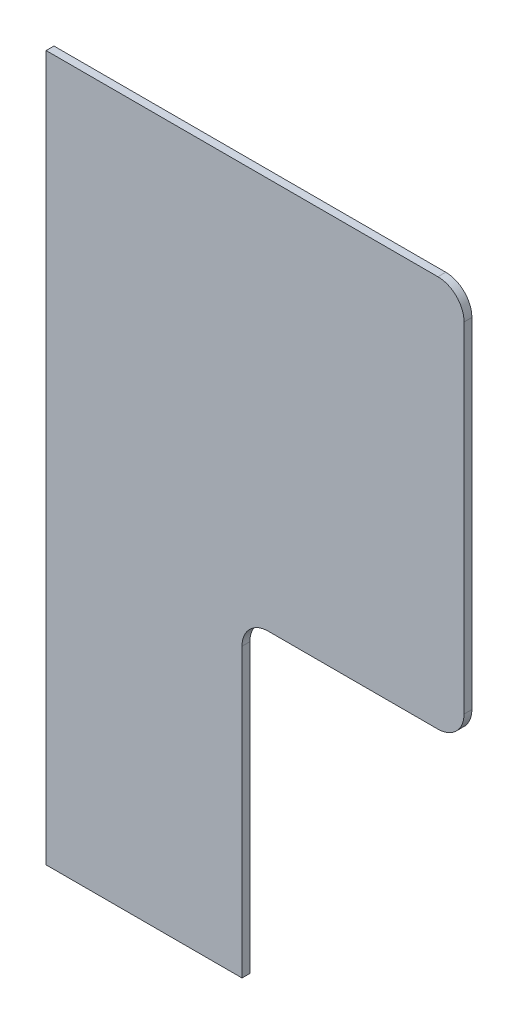
ISO-10303-21;
HEADER;
FILE_DESCRIPTION(('STEP AP214'),'2;1');
FILE_NAME('part.step','',(''),(''),'','','');
FILE_SCHEMA(('AUTOMOTIVE_DESIGN { 1 0 10303 214 1 1 1 1 }'));
ENDSEC;
DATA;
#1=APPLICATION_CONTEXT('core data for automotive mechanical design processes');
#2=APPLICATION_PROTOCOL_DEFINITION('international standard','automotive_design',2000,#1);
#3=PRODUCT_CONTEXT('',#1,'mechanical');
#4=PRODUCT('Part','Part','',(#3));
#5=PRODUCT_RELATED_PRODUCT_CATEGORY('part','',(#4));
#6=PRODUCT_DEFINITION_FORMATION('','',#4);
#7=PRODUCT_DEFINITION_CONTEXT('part definition',#1,'design');
#8=PRODUCT_DEFINITION('design','',#6,#7);
#9=PRODUCT_DEFINITION_SHAPE('','',#8);
#10=(LENGTH_UNIT() NAMED_UNIT(*) SI_UNIT(.MILLI.,.METRE.));
#11=(NAMED_UNIT(*) PLANE_ANGLE_UNIT() SI_UNIT($,.RADIAN.));
#12=(NAMED_UNIT(*) SI_UNIT($,.STERADIAN.) SOLID_ANGLE_UNIT());
#13=UNCERTAINTY_MEASURE_WITH_UNIT(LENGTH_MEASURE(1.E-05),#10,'distance_accuracy_value','');
#14=(GEOMETRIC_REPRESENTATION_CONTEXT(3) GLOBAL_UNCERTAINTY_ASSIGNED_CONTEXT((#13)) GLOBAL_UNIT_ASSIGNED_CONTEXT((#10,
#11,#12)) REPRESENTATION_CONTEXT('',''));
#15=CARTESIAN_POINT('',(0.,0.,0.));
#16=DIRECTION('',(0.,0.,1.));
#17=DIRECTION('',(1.,0.,0.));
#18=AXIS2_PLACEMENT_3D('',#15,#16,#17);
#19=CARTESIAN_POINT('',(0.,-10.,3.));
#20=DIRECTION('',(-1.,0.,0.));
#21=DIRECTION('',(0.,0.,1.));
#22=AXIS2_PLACEMENT_3D('',#19,#20,#21);
#23=PLANE('',#22);
#24=DIRECTION('',(0.,1.,0.));
#25=VECTOR('',#24,1.);
#26=CARTESIAN_POINT('',(0.,-10.,0.));
#27=LINE('',#26,#25);
#28=CARTESIAN_POINT('',(0.,-120.,0.));
#29=VERTEX_POINT('',#28);
#30=CARTESIAN_POINT('',(0.,-10.,0.));
#31=VERTEX_POINT('',#30);
#32=EDGE_CURVE('E135',#29,#31,#27,.T.);
#33=ORIENTED_EDGE('',*,*,#32,.T.);
#34=DIRECTION('',(0.,0.,-1.));
#35=VECTOR('',#34,1.);
#36=CARTESIAN_POINT('',(0.,-10.,3.));
#37=LINE('',#36,#35);
#38=CARTESIAN_POINT('',(0.,-10.,3.));
#39=VERTEX_POINT('',#38);
#40=EDGE_CURVE('E11',#39,#31,#37,.T.);
#41=ORIENTED_EDGE('',*,*,#40,.F.);
#42=DIRECTION('',(0.,1.,0.));
#43=VECTOR('',#42,1.);
#44=CARTESIAN_POINT('',(0.,-10.,3.));
#45=LINE('',#44,#43);
#46=CARTESIAN_POINT('',(0.,-120.,3.));
#47=VERTEX_POINT('',#46);
#48=EDGE_CURVE('E151',#47,#39,#45,.T.);
#49=ORIENTED_EDGE('',*,*,#48,.F.);
#50=DIRECTION('',(0.,0.,-1.));
#51=VECTOR('',#50,1.);
#52=CARTESIAN_POINT('',(0.,-120.,3.));
#53=LINE('',#52,#51);
#54=EDGE_CURVE('E131',#47,#29,#53,.T.);
#55=ORIENTED_EDGE('',*,*,#54,.T.);
#56=EDGE_LOOP('',(#33,#41,#49,#55));
#57=FACE_BOUND('',#56,.T.);
#58=ADVANCED_FACE('F33',(#57),#23,.F.);
#59=CARTESIAN_POINT('',(9.99999999999998,-10.,3.));
#60=DIRECTION('',(0.,0.,-1.));
#61=DIRECTION('',(-1.,0.,0.));
#62=AXIS2_PLACEMENT_3D('',#59,#60,#61);
#63=CYLINDRICAL_SURFACE('',#62,9.99999999999999);
#64=CARTESIAN_POINT('',(9.99999999999998,-10.,0.));
#65=DIRECTION('',(0.,0.,-1.));
#66=DIRECTION('',(1.,0.,0.));
#67=AXIS2_PLACEMENT_3D('',#64,#65,#66);
#68=CIRCLE('',#67,9.99999999999999);
#69=CARTESIAN_POINT('',(9.99999999999998,0.,0.));
#70=VERTEX_POINT('',#69);
#71=EDGE_CURVE('E138',#31,#70,#68,.T.);
#72=ORIENTED_EDGE('',*,*,#71,.T.);
#73=DIRECTION('',(0.,0.,-1.));
#74=VECTOR('',#73,1.);
#75=CARTESIAN_POINT('',(9.99999999999998,0.,3.));
#76=LINE('',#75,#74);
#77=CARTESIAN_POINT('',(9.99999999999998,0.,3.));
#78=VERTEX_POINT('',#77);
#79=EDGE_CURVE('E41',#78,#70,#76,.T.);
#80=ORIENTED_EDGE('',*,*,#79,.F.);
#81=CARTESIAN_POINT('',(9.99999999999998,-10.,3.));
#82=DIRECTION('',(0.,0.,-1.));
#83=DIRECTION('',(1.,0.,0.));
#84=AXIS2_PLACEMENT_3D('',#81,#82,#83);
#85=CIRCLE('',#84,9.99999999999999);
#86=EDGE_CURVE('E95',#39,#78,#85,.T.);
#87=ORIENTED_EDGE('',*,*,#86,.F.);
#88=ORIENTED_EDGE('',*,*,#40,.T.);
#89=EDGE_LOOP('',(#72,#80,#87,#88));
#90=FACE_BOUND('',#89,.T.);
#91=ADVANCED_FACE('F194',(#90),#63,.F.);
#92=CARTESIAN_POINT('',(75.,0.,3.));
#93=DIRECTION('',(0.,1.,0.));
#94=DIRECTION('',(0.,0.,1.));
#95=AXIS2_PLACEMENT_3D('',#92,#93,#94);
#96=PLANE('',#95);
#97=DIRECTION('',(1.,0.,0.));
#98=VECTOR('',#97,1.);
#99=CARTESIAN_POINT('',(75.,0.,0.));
#100=LINE('',#99,#98);
#101=CARTESIAN_POINT('',(75.,0.,0.));
#102=VERTEX_POINT('',#101);
#103=EDGE_CURVE('E140',#70,#102,#100,.T.);
#104=ORIENTED_EDGE('',*,*,#103,.T.);
#105=DIRECTION('',(0.,0.,-1.));
#106=VECTOR('',#105,1.);
#107=CARTESIAN_POINT('',(75.,0.,3.));
#108=LINE('',#107,#106);
#109=CARTESIAN_POINT('',(75.,0.,3.));
#110=VERTEX_POINT('',#109);
#111=EDGE_CURVE('E161',#110,#102,#108,.T.);
#112=ORIENTED_EDGE('',*,*,#111,.F.);
#113=DIRECTION('',(1.,0.,0.));
#114=VECTOR('',#113,1.);
#115=CARTESIAN_POINT('',(75.,0.,3.));
#116=LINE('',#115,#114);
#117=EDGE_CURVE('E169',#78,#110,#116,.T.);
#118=ORIENTED_EDGE('',*,*,#117,.F.);
#119=ORIENTED_EDGE('',*,*,#79,.T.);
#120=EDGE_LOOP('',(#104,#112,#118,#119));
#121=FACE_BOUND('',#120,.T.);
#122=ADVANCED_FACE('F167',(#121),#96,.F.);
#123=CARTESIAN_POINT('',(75.,10.,3.));
#124=DIRECTION('',(0.,0.,-1.));
#125=DIRECTION('',(-1.,0.,0.));
#126=AXIS2_PLACEMENT_3D('',#123,#124,#125);
#127=CYLINDRICAL_SURFACE('',#126,10.);
#128=CARTESIAN_POINT('',(75.,10.,0.));
#129=DIRECTION('',(0.,0.,1.));
#130=DIRECTION('',(-1.,0.,0.));
#131=AXIS2_PLACEMENT_3D('',#128,#129,#130);
#132=CIRCLE('',#131,10.);
#133=CARTESIAN_POINT('',(85.,10.,0.));
#134=VERTEX_POINT('',#133);
#135=EDGE_CURVE('E142',#102,#134,#132,.T.);
#136=ORIENTED_EDGE('',*,*,#135,.T.);
#137=DIRECTION('',(0.,0.,-1.));
#138=VECTOR('',#137,1.);
#139=CARTESIAN_POINT('',(85.,10.,3.));
#140=LINE('',#139,#138);
#141=CARTESIAN_POINT('',(85.,10.,3.));
#142=VERTEX_POINT('',#141);
#143=EDGE_CURVE('E158',#142,#134,#140,.T.);
#144=ORIENTED_EDGE('',*,*,#143,.F.);
#145=CARTESIAN_POINT('',(75.,10.,3.));
#146=DIRECTION('',(0.,0.,1.));
#147=DIRECTION('',(-1.,0.,0.));
#148=AXIS2_PLACEMENT_3D('',#145,#146,#147);
#149=CIRCLE('',#148,10.);
#150=EDGE_CURVE('E185',#110,#142,#149,.T.);
#151=ORIENTED_EDGE('',*,*,#150,.F.);
#152=ORIENTED_EDGE('',*,*,#111,.T.);
#153=EDGE_LOOP('',(#136,#144,#151,#152));
#154=FACE_BOUND('',#153,.T.);
#155=ADVANCED_FACE('F178',(#154),#127,.T.);
#156=CARTESIAN_POINT('',(85.,140.,3.));
#157=DIRECTION('',(-1.,0.,0.));
#158=DIRECTION('',(0.,0.,1.));
#159=AXIS2_PLACEMENT_3D('',#156,#157,#158);
#160=PLANE('',#159);
#161=DIRECTION('',(0.,1.,0.));
#162=VECTOR('',#161,1.);
#163=CARTESIAN_POINT('',(85.,140.,0.));
#164=LINE('',#163,#162);
#165=CARTESIAN_POINT('',(85.,140.,0.));
#166=VERTEX_POINT('',#165);
#167=EDGE_CURVE('E144',#134,#166,#164,.T.);
#168=ORIENTED_EDGE('',*,*,#167,.T.);
#169=DIRECTION('',(0.,0.,-1.));
#170=VECTOR('',#169,1.);
#171=CARTESIAN_POINT('',(85.,140.,3.));
#172=LINE('',#171,#170);
#173=CARTESIAN_POINT('',(85.,140.,3.));
#174=VERTEX_POINT('',#173);
#175=EDGE_CURVE('E155',#174,#166,#172,.T.);
#176=ORIENTED_EDGE('',*,*,#175,.F.);
#177=DIRECTION('',(0.,1.,0.));
#178=VECTOR('',#177,1.);
#179=CARTESIAN_POINT('',(85.,140.,3.));
#180=LINE('',#179,#178);
#181=EDGE_CURVE('E184',#142,#174,#180,.T.);
#182=ORIENTED_EDGE('',*,*,#181,.F.);
#183=ORIENTED_EDGE('',*,*,#143,.T.);
#184=EDGE_LOOP('',(#168,#176,#182,#183));
#185=FACE_BOUND('',#184,.T.);
#186=ADVANCED_FACE('F182',(#185),#160,.F.);
#187=CARTESIAN_POINT('',(75.,140.,3.));
#188=DIRECTION('',(0.,0.,-1.));
#189=DIRECTION('',(-1.,0.,0.));
#190=AXIS2_PLACEMENT_3D('',#187,#188,#189);
#191=CYLINDRICAL_SURFACE('',#190,9.99999999999999);
#192=CARTESIAN_POINT('',(75.,140.,0.));
#193=DIRECTION('',(0.,0.,1.));
#194=DIRECTION('',(-1.,0.,0.));
#195=AXIS2_PLACEMENT_3D('',#192,#193,#194);
#196=CIRCLE('',#195,9.99999999999999);
#197=CARTESIAN_POINT('',(75.,150.,0.));
#198=VERTEX_POINT('',#197);
#199=EDGE_CURVE('E146',#166,#198,#196,.T.);
#200=ORIENTED_EDGE('',*,*,#199,.T.);
#201=DIRECTION('',(0.,0.,-1.));
#202=VECTOR('',#201,1.);
#203=CARTESIAN_POINT('',(75.,150.,3.));
#204=LINE('',#203,#202);
#205=CARTESIAN_POINT('',(75.,150.,3.));
#206=VERTEX_POINT('',#205);
#207=EDGE_CURVE('E126',#206,#198,#204,.T.);
#208=ORIENTED_EDGE('',*,*,#207,.F.);
#209=CARTESIAN_POINT('',(75.,140.,3.));
#210=DIRECTION('',(0.,0.,1.));
#211=DIRECTION('',(-1.,0.,0.));
#212=AXIS2_PLACEMENT_3D('',#209,#210,#211);
#213=CIRCLE('',#212,9.99999999999999);
#214=EDGE_CURVE('E117',#174,#206,#213,.T.);
#215=ORIENTED_EDGE('',*,*,#214,.F.);
#216=ORIENTED_EDGE('',*,*,#175,.T.);
#217=EDGE_LOOP('',(#200,#208,#215,#216));
#218=FACE_BOUND('',#217,.T.);
#219=ADVANCED_FACE('F206',(#218),#191,.T.);
#220=CARTESIAN_POINT('',(-74.9999999999999,150.,3.));
#221=DIRECTION('',(0.,-1.,0.));
#222=DIRECTION('',(0.,0.,-1.));
#223=AXIS2_PLACEMENT_3D('',#220,#221,#222);
#224=PLANE('',#223);
#225=DIRECTION('',(-1.,0.,0.));
#226=VECTOR('',#225,1.);
#227=CARTESIAN_POINT('',(-74.9999999999999,150.,0.));
#228=LINE('',#227,#226);
#229=CARTESIAN_POINT('',(-74.9999999999999,150.,0.));
#230=VERTEX_POINT('',#229);
#231=EDGE_CURVE('E125',#198,#230,#228,.T.);
#232=ORIENTED_EDGE('',*,*,#231,.T.);
#233=DIRECTION('',(0.,0.,-1.));
#234=VECTOR('',#233,1.);
#235=CARTESIAN_POINT('',(-74.9999999999999,150.,3.));
#236=LINE('',#235,#234);
#237=CARTESIAN_POINT('',(-74.9999999999999,150.,3.));
#238=VERTEX_POINT('',#237);
#239=EDGE_CURVE('E122',#238,#230,#236,.T.);
#240=ORIENTED_EDGE('',*,*,#239,.F.);
#241=DIRECTION('',(-1.,0.,0.));
#242=VECTOR('',#241,1.);
#243=CARTESIAN_POINT('',(-74.9999999999999,150.,3.));
#244=LINE('',#243,#242);
#245=EDGE_CURVE('E111',#206,#238,#244,.T.);
#246=ORIENTED_EDGE('',*,*,#245,.F.);
#247=ORIENTED_EDGE('',*,*,#207,.T.);
#248=EDGE_LOOP('',(#232,#240,#246,#247));
#249=FACE_BOUND('',#248,.T.);
#250=ADVANCED_FACE('F123',(#249),#224,.F.);
#251=CARTESIAN_POINT('',(-75.,-120.,3.));
#252=DIRECTION('',(1.,0.,0.));
#253=DIRECTION('',(0.,1.,0.));
#254=AXIS2_PLACEMENT_3D('',#251,#252,#253);
#255=PLANE('',#254);
#256=DIRECTION('',(0.,-1.,0.));
#257=VECTOR('',#256,1.);
#258=CARTESIAN_POINT('',(-75.,-120.,0.));
#259=LINE('',#258,#257);
#260=CARTESIAN_POINT('',(-75.,-120.,0.));
#261=VERTEX_POINT('',#260);
#262=EDGE_CURVE('E81',#230,#261,#259,.T.);
#263=ORIENTED_EDGE('',*,*,#262,.T.);
#264=DIRECTION('',(0.,0.,-1.));
#265=VECTOR('',#264,1.);
#266=CARTESIAN_POINT('',(-75.,-120.,3.));
#267=LINE('',#266,#265);
#268=CARTESIAN_POINT('',(-75.,-120.,3.));
#269=VERTEX_POINT('',#268);
#270=EDGE_CURVE('E127',#269,#261,#267,.T.);
#271=ORIENTED_EDGE('',*,*,#270,.F.);
#272=DIRECTION('',(0.,-1.,0.));
#273=VECTOR('',#272,1.);
#274=CARTESIAN_POINT('',(-75.,-120.,3.));
#275=LINE('',#274,#273);
#276=EDGE_CURVE('E115',#238,#269,#275,.T.);
#277=ORIENTED_EDGE('',*,*,#276,.F.);
#278=ORIENTED_EDGE('',*,*,#239,.T.);
#279=EDGE_LOOP('',(#263,#271,#277,#278));
#280=FACE_BOUND('',#279,.T.);
#281=ADVANCED_FACE('F129',(#280),#255,.F.);
#282=CARTESIAN_POINT('',(0.,-120.,3.));
#283=DIRECTION('',(0.,1.,0.));
#284=DIRECTION('',(0.,0.,1.));
#285=AXIS2_PLACEMENT_3D('',#282,#283,#284);
#286=PLANE('',#285);
#287=DIRECTION('',(1.,0.,0.));
#288=VECTOR('',#287,1.);
#289=CARTESIAN_POINT('',(0.,-120.,0.));
#290=LINE('',#289,#288);
#291=EDGE_CURVE('E87',#261,#29,#290,.T.);
#292=ORIENTED_EDGE('',*,*,#291,.T.);
#293=ORIENTED_EDGE('',*,*,#54,.F.);
#294=DIRECTION('',(1.,0.,0.));
#295=VECTOR('',#294,1.);
#296=CARTESIAN_POINT('',(0.,-120.,3.));
#297=LINE('',#296,#295);
#298=EDGE_CURVE('E49',#269,#47,#297,.T.);
#299=ORIENTED_EDGE('',*,*,#298,.F.);
#300=ORIENTED_EDGE('',*,*,#270,.T.);
#301=EDGE_LOOP('',(#292,#293,#299,#300));
#302=FACE_BOUND('',#301,.T.);
#303=ADVANCED_FACE('F214',(#302),#286,.F.);
#304=CARTESIAN_POINT('',(75.,140.,3.));
#305=DIRECTION('',(0.,0.,-1.));
#306=DIRECTION('',(-1.,0.,0.));
#307=AXIS2_PLACEMENT_3D('',#304,#305,#306);
#308=PLANE('',#307);
#309=ORIENTED_EDGE('',*,*,#48,.T.);
#310=ORIENTED_EDGE('',*,*,#86,.T.);
#311=ORIENTED_EDGE('',*,*,#117,.T.);
#312=ORIENTED_EDGE('',*,*,#150,.T.);
#313=ORIENTED_EDGE('',*,*,#181,.T.);
#314=ORIENTED_EDGE('',*,*,#214,.T.);
#315=ORIENTED_EDGE('',*,*,#245,.T.);
#316=ORIENTED_EDGE('',*,*,#276,.T.);
#317=ORIENTED_EDGE('',*,*,#298,.T.);
#318=EDGE_LOOP('',(#309,#310,#311,#312,#313,#314,#315,#316,#317));
#319=FACE_BOUND('',#318,.T.);
#320=ADVANCED_FACE('F113',(#319),#308,.F.);
#321=CARTESIAN_POINT('',(75.,140.,0.));
#322=DIRECTION('',(0.,0.,-1.));
#323=DIRECTION('',(-1.,0.,0.));
#324=AXIS2_PLACEMENT_3D('',#321,#322,#323);
#325=PLANE('',#324);
#326=ORIENTED_EDGE('',*,*,#32,.F.);
#327=ORIENTED_EDGE('',*,*,#291,.F.);
#328=ORIENTED_EDGE('',*,*,#262,.F.);
#329=ORIENTED_EDGE('',*,*,#231,.F.);
#330=ORIENTED_EDGE('',*,*,#199,.F.);
#331=ORIENTED_EDGE('',*,*,#167,.F.);
#332=ORIENTED_EDGE('',*,*,#135,.F.);
#333=ORIENTED_EDGE('',*,*,#103,.F.);
#334=ORIENTED_EDGE('',*,*,#71,.F.);
#335=EDGE_LOOP('',(#326,#327,#328,#329,#330,#331,#332,#333,#334));
#336=FACE_BOUND('',#335,.T.);
#337=ADVANCED_FACE('F173',(#336),#325,.T.);
#338=CLOSED_SHELL('',(#58,#91,#122,#155,#186,#219,#250,#281,#303,#320,#337));
#339=MANIFOLD_SOLID_BREP('B2',#338);
#340=ADVANCED_BREP_SHAPE_REPRESENTATION('',(#18,#339),#14);
#341=SHAPE_DEFINITION_REPRESENTATION(#9,#340);
ENDSEC;
END-ISO-10303-21;
